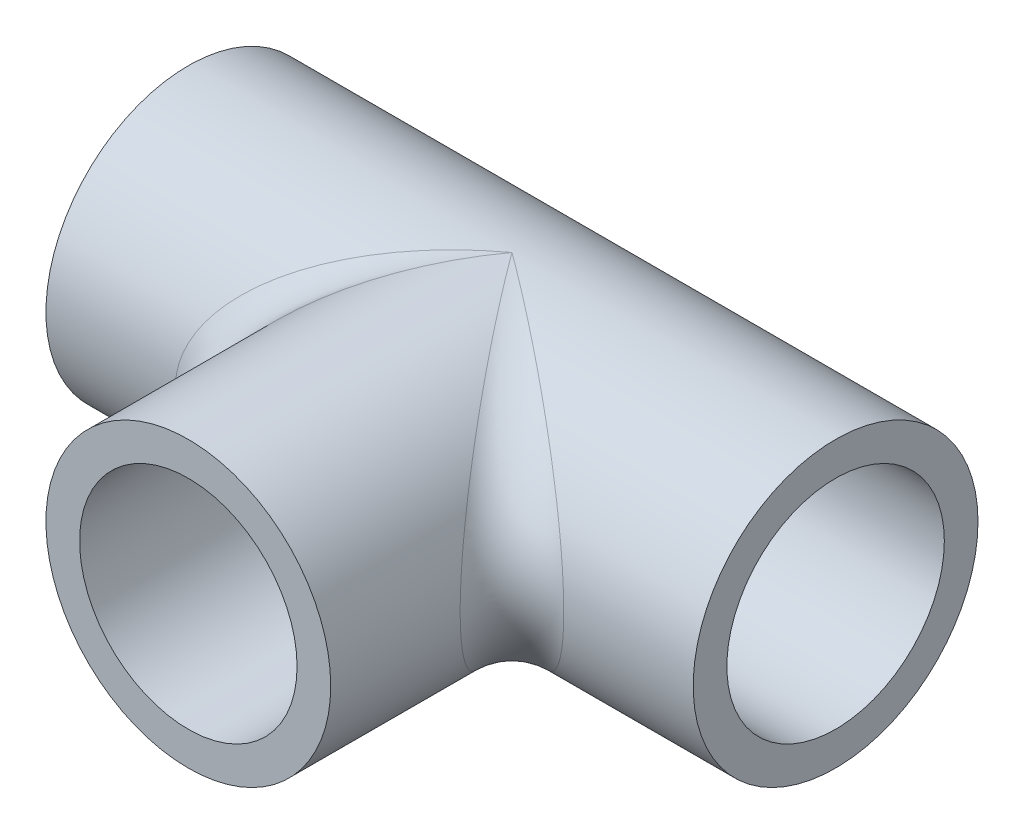
ISO-10303-21;
HEADER;
FILE_DESCRIPTION(('STEP AP214'),'2;1');
FILE_NAME('part.step','',(''),(''),'','','');
FILE_SCHEMA(('AUTOMOTIVE_DESIGN { 1 0 10303 214 1 1 1 1 }'));
ENDSEC;
DATA;
#1=APPLICATION_CONTEXT('core data for automotive mechanical design processes');
#2=APPLICATION_PROTOCOL_DEFINITION('international standard','automotive_design',2000,#1);
#3=PRODUCT_CONTEXT('',#1,'mechanical');
#4=PRODUCT('Part','Part','',(#3));
#5=PRODUCT_RELATED_PRODUCT_CATEGORY('part','',(#4));
#6=PRODUCT_DEFINITION_FORMATION('','',#4);
#7=PRODUCT_DEFINITION_CONTEXT('part definition',#1,'design');
#8=PRODUCT_DEFINITION('design','',#6,#7);
#9=PRODUCT_DEFINITION_SHAPE('','',#8);
#10=(LENGTH_UNIT() NAMED_UNIT(*) SI_UNIT(.MILLI.,.METRE.));
#11=(NAMED_UNIT(*) PLANE_ANGLE_UNIT() SI_UNIT($,.RADIAN.));
#12=(NAMED_UNIT(*) SI_UNIT($,.STERADIAN.) SOLID_ANGLE_UNIT());
#13=UNCERTAINTY_MEASURE_WITH_UNIT(LENGTH_MEASURE(1.E-05),#10,'distance_accuracy_value','');
#14=(GEOMETRIC_REPRESENTATION_CONTEXT(3) GLOBAL_UNCERTAINTY_ASSIGNED_CONTEXT((#13)) GLOBAL_UNIT_ASSIGNED_CONTEXT((#10,
#11,#12)) REPRESENTATION_CONTEXT('',''));
#15=CARTESIAN_POINT('',(0.,0.,0.));
#16=DIRECTION('',(0.,0.,1.));
#17=DIRECTION('',(1.,0.,0.));
#18=AXIS2_PLACEMENT_3D('',#15,#16,#17);
#19=CARTESIAN_POINT('',(63.5,0.,0.));
#20=DIRECTION('',(-1.,0.,0.));
#21=DIRECTION('',(0.,0.,1.));
#22=AXIS2_PLACEMENT_3D('',#19,#20,#21);
#23=CYLINDRICAL_SURFACE('',#22,13.97);
#24=CARTESIAN_POINT('',(0.,0.,0.));
#25=DIRECTION('',(1.,0.,0.));
#26=DIRECTION('',(0.,0.,-1.));
#27=AXIS2_PLACEMENT_3D('',#24,#25,#26);
#28=CIRCLE('',#27,13.97);
#29=CARTESIAN_POINT('',(0.,0.,-13.97));
#30=VERTEX_POINT('',#29);
#31=EDGE_CURVE('E115',#30,#30,#28,.T.);
#32=ORIENTED_EDGE('',*,*,#31,.T.);
#33=EDGE_LOOP('',(#32));
#34=FACE_BOUND('',#33,.T.);
#35=CARTESIAN_POINT('',(63.5,0.,0.));
#36=DIRECTION('',(1.,0.,0.));
#37=DIRECTION('',(0.,0.,-1.));
#38=AXIS2_PLACEMENT_3D('',#35,#36,#37);
#39=CIRCLE('',#38,13.97);
#40=CARTESIAN_POINT('',(63.5,0.,-13.97));
#41=VERTEX_POINT('',#40);
#42=EDGE_CURVE('E67',#41,#41,#39,.T.);
#43=ORIENTED_EDGE('',*,*,#42,.F.);
#44=EDGE_LOOP('',(#43));
#45=FACE_BOUND('',#44,.T.);
#46=CARTESIAN_POINT('',(31.75,0.,0.));
#47=DIRECTION('',(0.591363663627517,0.,0.806404995855705));
#48=DIRECTION('',(0.806404995855705,0.,-0.591363663627517));
#49=AXIS2_PLACEMENT_3D('',#46,#47,#48);
#50=ELLIPSE('',#49,23.6233655519276,13.97);
#51=CARTESIAN_POINT('',(31.75,-13.97,0.));
#52=VERTEX_POINT('',#51);
#53=CARTESIAN_POINT('',(31.75,13.97,0.));
#54=VERTEX_POINT('',#53);
#55=EDGE_CURVE('E45',#52,#54,#50,.F.);
#56=ORIENTED_EDGE('',*,*,#55,.T.);
#57=CARTESIAN_POINT('',(31.75,0.,0.));
#58=DIRECTION('',(-0.591363663627517,0.,0.806404995855705));
#59=DIRECTION('',(-0.806404995855705,0.,-0.591363663627517));
#60=AXIS2_PLACEMENT_3D('',#57,#58,#59);
#61=ELLIPSE('',#60,23.6233655519276,13.97);
#62=EDGE_CURVE('E11',#54,#52,#61,.F.);
#63=ORIENTED_EDGE('',*,*,#62,.T.);
#64=EDGE_LOOP('',(#56,#63));
#65=FACE_BOUND('',#64,.T.);
#66=ADVANCED_FACE('F32',(#34,#45,#65),#23,.T.);
#67=CARTESIAN_POINT('',(63.5,0.,0.));
#68=DIRECTION('',(-1.,0.,0.));
#69=DIRECTION('',(0.,0.,1.));
#70=AXIS2_PLACEMENT_3D('',#67,#68,#69);
#71=CYLINDRICAL_SURFACE('',#70,10.668);
#72=CARTESIAN_POINT('',(31.75,0.,0.));
#73=DIRECTION('',(0.707106781186547,0.,0.707106781186547));
#74=DIRECTION('',(-0.707106781186547,0.,0.707106781186547));
#75=AXIS2_PLACEMENT_3D('',#72,#73,#74);
#76=ELLIPSE('',#75,15.0868302833962,10.668);
#77=CARTESIAN_POINT('',(31.75,-10.668,0.));
#78=VERTEX_POINT('',#77);
#79=CARTESIAN_POINT('',(31.75,10.668,0.));
#80=VERTEX_POINT('',#79);
#81=EDGE_CURVE('E63',#78,#80,#76,.F.);
#82=ORIENTED_EDGE('',*,*,#81,.F.);
#83=CARTESIAN_POINT('',(31.75,0.,0.));
#84=DIRECTION('',(-0.707106781186547,0.,0.707106781186547));
#85=DIRECTION('',(0.707106781186547,0.,0.707106781186547));
#86=AXIS2_PLACEMENT_3D('',#83,#84,#85);
#87=ELLIPSE('',#86,15.0868302833962,10.668);
#88=EDGE_CURVE('E52',#80,#78,#87,.F.);
#89=ORIENTED_EDGE('',*,*,#88,.F.);
#90=EDGE_LOOP('',(#82,#89));
#91=FACE_BOUND('',#90,.T.);
#92=CARTESIAN_POINT('',(63.5,0.,0.));
#93=DIRECTION('',(1.,0.,0.));
#94=DIRECTION('',(0.,0.,-1.));
#95=AXIS2_PLACEMENT_3D('',#92,#93,#94);
#96=CIRCLE('',#95,10.668);
#97=CARTESIAN_POINT('',(63.5,0.,-10.668));
#98=VERTEX_POINT('',#97);
#99=EDGE_CURVE('E188',#98,#98,#96,.T.);
#100=ORIENTED_EDGE('',*,*,#99,.T.);
#101=EDGE_LOOP('',(#100));
#102=FACE_BOUND('',#101,.T.);
#103=CARTESIAN_POINT('',(0.,0.,0.));
#104=DIRECTION('',(1.,0.,0.));
#105=DIRECTION('',(0.,0.,-1.));
#106=AXIS2_PLACEMENT_3D('',#103,#104,#105);
#107=CIRCLE('',#106,10.668);
#108=CARTESIAN_POINT('',(0.,0.,-10.668));
#109=VERTEX_POINT('',#108);
#110=EDGE_CURVE('E185',#109,#109,#107,.T.);
#111=ORIENTED_EDGE('',*,*,#110,.F.);
#112=EDGE_LOOP('',(#111));
#113=FACE_BOUND('',#112,.T.);
#114=ADVANCED_FACE('F64',(#91,#102,#113),#71,.F.);
#115=CARTESIAN_POINT('',(63.5,0.,0.));
#116=DIRECTION('',(1.,0.,0.));
#117=DIRECTION('',(0.,0.,-1.));
#118=AXIS2_PLACEMENT_3D('',#115,#116,#117);
#119=PLANE('',#118);
#120=ORIENTED_EDGE('',*,*,#42,.T.);
#121=EDGE_LOOP('',(#120));
#122=FACE_BOUND('',#121,.T.);
#123=ORIENTED_EDGE('',*,*,#99,.F.);
#124=EDGE_LOOP('',(#123));
#125=FACE_BOUND('',#124,.T.);
#126=ADVANCED_FACE('F100',(#122,#125),#119,.T.);
#127=CARTESIAN_POINT('',(0.,0.,0.));
#128=DIRECTION('',(1.,0.,0.));
#129=DIRECTION('',(0.,0.,-1.));
#130=AXIS2_PLACEMENT_3D('',#127,#128,#129);
#131=PLANE('',#130);
#132=ORIENTED_EDGE('',*,*,#31,.F.);
#133=EDGE_LOOP('',(#132));
#134=FACE_BOUND('',#133,.T.);
#135=ORIENTED_EDGE('',*,*,#110,.T.);
#136=EDGE_LOOP('',(#135));
#137=FACE_BOUND('',#136,.T.);
#138=ADVANCED_FACE('F94',(#134,#137),#131,.F.);
#139=CARTESIAN_POINT('',(31.75,0.,31.75));
#140=DIRECTION('',(0.,0.,-1.));
#141=DIRECTION('',(-1.,0.,0.));
#142=AXIS2_PLACEMENT_3D('',#139,#140,#141);
#143=CYLINDRICAL_SURFACE('',#142,13.97);
#144=CARTESIAN_POINT('',(31.75,0.,31.75));
#145=DIRECTION('',(0.,0.,1.));
#146=DIRECTION('',(1.,0.,0.));
#147=AXIS2_PLACEMENT_3D('',#144,#145,#146);
#148=CIRCLE('',#147,13.97);
#149=CARTESIAN_POINT('',(45.72,0.,31.75));
#150=VERTEX_POINT('',#149);
#151=EDGE_CURVE('E184',#150,#150,#148,.T.);
#152=ORIENTED_EDGE('',*,*,#151,.F.);
#153=EDGE_LOOP('',(#152));
#154=FACE_BOUND('',#153,.T.);
#155=CARTESIAN_POINT('',(31.75,0.,0.));
#156=DIRECTION('',(0.806404995855705,0.,0.591363663627517));
#157=DIRECTION('',(0.591363663627518,0.,-0.806404995855706));
#158=AXIS2_PLACEMENT_3D('',#155,#156,#157);
#159=ELLIPSE('',#158,23.6233655519276,13.97);
#160=EDGE_CURVE('E71',#54,#52,#159,.T.);
#161=ORIENTED_EDGE('',*,*,#160,.T.);
#162=CARTESIAN_POINT('',(31.75,0.,0.));
#163=DIRECTION('',(-0.806404995855705,0.,0.591363663627517));
#164=DIRECTION('',(-0.591363663627518,0.,-0.806404995855706));
#165=AXIS2_PLACEMENT_3D('',#162,#163,#164);
#166=ELLIPSE('',#165,23.6233655519276,13.97);
#167=EDGE_CURVE('E74',#52,#54,#166,.T.);
#168=ORIENTED_EDGE('',*,*,#167,.T.);
#169=EDGE_LOOP('',(#161,#168));
#170=FACE_BOUND('',#169,.T.);
#171=ADVANCED_FACE('F88',(#154,#170),#143,.T.);
#172=CARTESIAN_POINT('',(31.75,0.,31.75));
#173=DIRECTION('',(0.,0.,1.));
#174=DIRECTION('',(1.,0.,0.));
#175=AXIS2_PLACEMENT_3D('',#172,#173,#174);
#176=PLANE('',#175);
#177=CARTESIAN_POINT('',(31.75,0.,31.75));
#178=DIRECTION('',(0.,0.,1.));
#179=DIRECTION('',(1.,0.,0.));
#180=AXIS2_PLACEMENT_3D('',#177,#178,#179);
#181=CIRCLE('',#180,10.668);
#182=CARTESIAN_POINT('',(42.418,0.,31.75));
#183=VERTEX_POINT('',#182);
#184=EDGE_CURVE('E181',#183,#183,#181,.T.);
#185=ORIENTED_EDGE('',*,*,#184,.F.);
#186=EDGE_LOOP('',(#185));
#187=FACE_BOUND('',#186,.T.);
#188=ORIENTED_EDGE('',*,*,#151,.T.);
#189=EDGE_LOOP('',(#188));
#190=FACE_BOUND('',#189,.T.);
#191=ADVANCED_FACE('F93',(#187,#190),#176,.T.);
#192=CARTESIAN_POINT('',(31.75,0.,0.));
#193=DIRECTION('',(0.,0.,1.));
#194=DIRECTION('',(1.,0.,0.));
#195=AXIS2_PLACEMENT_3D('',#192,#193,#194);
#196=CYLINDRICAL_SURFACE('',#195,10.668);
#197=ORIENTED_EDGE('',*,*,#81,.T.);
#198=ORIENTED_EDGE('',*,*,#88,.T.);
#199=EDGE_LOOP('',(#197,#198));
#200=FACE_BOUND('',#199,.T.);
#201=ORIENTED_EDGE('',*,*,#184,.T.);
#202=EDGE_LOOP('',(#201));
#203=FACE_BOUND('',#202,.T.);
#204=ADVANCED_FACE('F69',(#200,#203),#196,.F.);
#205=CARTESIAN_POINT('',(31.75,13.97,0.));
#206=CARTESIAN_POINT('',(31.75,13.97,0.));
#207=CARTESIAN_POINT('',(31.75,13.97,0.));
#208=CARTESIAN_POINT('',(32.1649961409285,13.9699842549138,0.304330503347444));
#209=CARTESIAN_POINT('',(32.1096667924862,13.9700565659444,0.359666792486184));
#210=CARTESIAN_POINT('',(32.0543305033475,13.9699842549138,0.414996140928427));
#211=CARTESIAN_POINT('',(32.5799942044309,13.9600546274544,0.60866241658257));
#212=CARTESIAN_POINT('',(32.4695849669771,13.9564355039773,0.719584966977063));
#213=CARTESIAN_POINT('',(32.3586624165826,13.9600546274544,0.829994204430851));
#214=CARTESIAN_POINT('',(33.409133917505,13.9202548869246,1.21669820617027));
#215=CARTESIAN_POINT('',(33.1874610679892,13.9021529393189,1.43746106798917));
#216=CARTESIAN_POINT('',(32.9666982061703,13.9202548869246,1.65913391750493));
#217=CARTESIAN_POINT('',(33.8232754927435,13.8903831104209,1.52040202801192));
#218=CARTESIAN_POINT('',(33.5459278597396,13.8614118727784,1.79592785973961));
#219=CARTESIAN_POINT('',(33.2704020280119,13.8903831104209,2.07327549274349));
#220=CARTESIAN_POINT('',(34.6462511734208,13.8109262874391,2.12391752717521));
#221=CARTESIAN_POINT('',(34.2563205524132,13.753321149772,2.5063205524132));
#222=CARTESIAN_POINT('',(33.8739175271752,13.8109262874391,2.89625117342079));
#223=CARTESIAN_POINT('',(35.0551004341886,13.7615113850433,2.42374031840482));
#224=CARTESIAN_POINT('',(34.6087738785299,13.6860481220881,2.8587738785299));
#225=CARTESIAN_POINT('',(34.1737403184048,13.7615113850433,3.30510043418856));
#226=CARTESIAN_POINT('',(35.8700560708564,13.6427642875103,3.02137445196121));
#227=CARTESIAN_POINT('',(35.3086840568561,13.5249802993024,3.55868405685604));
#228=CARTESIAN_POINT('',(34.7713744519612,13.6427642875102,4.12005607085638));
#229=CARTESIAN_POINT('',(36.276162507797,13.5734325371204,3.31918583905111));
#230=CARTESIAN_POINT('',(35.6566110960411,13.4309598012804,3.90661109604107));
#231=CARTESIAN_POINT('',(35.0691858390511,13.5734325371204,4.52616250779703));
#232=CARTESIAN_POINT('',(37.4754070464454,13.3377932208124,4.19863183406005));
#233=CARTESIAN_POINT('',(36.6817571660308,13.111757973356,4.93175716603084));
#234=CARTESIAN_POINT('',(35.94863183406,13.3377932208124,5.72540704644541));
#235=CARTESIAN_POINT('',(38.2634853888728,13.1425017232505,4.77655595184007));
#236=CARTESIAN_POINT('',(37.3494701611708,12.8475273175663,5.59947016117086));
#237=CARTESIAN_POINT('',(36.5265559518401,13.1425017232505,6.5134853888728));
#238=CARTESIAN_POINT('',(39.7976214764494,12.6765037832777,5.90158908272951));
#239=CARTESIAN_POINT('',(38.6278252269399,12.22662585353,6.87782522693993));
#240=CARTESIAN_POINT('',(37.6515890827295,12.6765037832777,8.04762147644935));
#241=CARTESIAN_POINT('',(40.5442361255514,12.4077736556231,6.44910649207104));
#242=CARTESIAN_POINT('',(39.2423649749254,11.8690544436702,7.49236497492535));
#243=CARTESIAN_POINT('',(38.199106492071,12.4077736556231,8.79423612555139));
#244=CARTESIAN_POINT('',(41.9825036125598,11.7988243090196,7.5038359825438));
#245=CARTESIAN_POINT('',(40.3985470657572,11.0750005835077,8.6485470657572));
#246=CARTESIAN_POINT('',(39.2538359825438,11.7988243090196,10.2325036125598));
#247=CARTESIAN_POINT('',(42.6751494535918,11.4611528572707,8.01177626596719));
#248=CARTESIAN_POINT('',(40.9438472385974,10.6373830021085,9.19384723859744));
#249=CARTESIAN_POINT('',(39.7617762659672,11.4611528572707,10.9251494535918));
#250=CARTESIAN_POINT('',(43.9931386183787,10.7195012792805,8.97830165347782));
#251=CARTESIAN_POINT('',(41.9476306699542,9.70167833694517,10.1976306699542));
#252=CARTESIAN_POINT('',(40.7283016534778,10.7195012792805,12.2431386183787));
#253=CARTESIAN_POINT('',(44.6200391623138,10.3185278852442,9.43802871903048));
#254=CARTESIAN_POINT('',(42.4093836661912,9.20234455201332,10.6593836661912));
#255=CARTESIAN_POINT('',(41.1880287190305,10.3185278852442,12.8700391623138));
#256=CARTESIAN_POINT('',(45.79515323048,9.45679100040555,10.299779035685));
#257=CARTESIAN_POINT('',(43.2359373323625,8.16697151263523,11.4859373323625));
#258=CARTESIAN_POINT('',(42.049779035685,9.45679100040555,14.04515323048));
#259=CARTESIAN_POINT('',(46.345581201294,8.99930243736231,10.703426214281));
#260=CARTESIAN_POINT('',(43.6034390252966,7.62980546575549,11.8534390252966));
#261=CARTESIAN_POINT('',(42.453426214281,8.99930243736231,14.595581201294));
#262=CARTESIAN_POINT('',(47.3579069654916,8.03173691720862,11.4457984413618));
#263=CARTESIAN_POINT('',(44.2374735442825,6.54692317412924,12.4874735442825));
#264=CARTESIAN_POINT('',(43.1957984413618,8.03173691720862,15.6079069654916));
#265=CARTESIAN_POINT('',(47.8226719732002,7.52494798265213,11.7866261136848));
#266=CARTESIAN_POINT('',(44.5059893267681,6.00053730086408,12.7559893267681));
#267=CARTESIAN_POINT('',(43.5366261136848,7.52494798265213,16.0726719732002));
#268=CARTESIAN_POINT('',(48.4511500062733,6.72669841329189,12.2475100045982));
#269=CARTESIAN_POINT('',(44.8370335359023,5.19695243111478,13.0870335359023));
#270=CARTESIAN_POINT('',(43.9975100045982,6.72669841329189,16.7011500062733));
#271=CARTESIAN_POINT('',(48.6454414853623,6.460808389166,12.3899904225927));
#272=CARTESIAN_POINT('',(44.9346954905956,4.93463298524042,13.1846954905956));
#273=CARTESIAN_POINT('',(44.1399904225927,6.460808389166,16.8954414853623));
#274=CARTESIAN_POINT('',(49.0135962612215,5.91428972249239,12.6599705915581));
#275=CARTESIAN_POINT('',(45.1104469887237,4.41268036659763,13.3604469887237));
#276=CARTESIAN_POINT('',(44.4099705915581,5.91428972249239,17.2635962612215));
#277=CARTESIAN_POINT('',(49.1874686016766,5.63366768508603,12.7874769745647));
#278=CARTESIAN_POINT('',(45.1881862457653,4.15329811076541,13.4381862457653));
#279=CARTESIAN_POINT('',(44.5374769745647,5.63366768508603,17.4374686016766));
#280=CARTESIAN_POINT('',(49.5060389526682,5.06966569867454,13.021095231955));
#281=CARTESIAN_POINT('',(45.3223002745049,3.65069095238762,13.5723002745049));
#282=CARTESIAN_POINT('',(44.771095231955,5.06966569867454,17.7560389526682));
#283=CARTESIAN_POINT('',(49.6516071823309,4.78681523114474,13.1278452670319));
#284=CARTESIAN_POINT('',(45.3791059740195,3.40747584858286,13.6291059740195));
#285=CARTESIAN_POINT('',(44.8778452670319,4.78681523114474,17.9016071823309));
#286=CARTESIAN_POINT('',(49.9193211320922,4.20954793696451,13.3241688301898));
#287=CARTESIAN_POINT('',(45.4770759790601,2.92921539400913,13.7270759790602));
#288=CARTESIAN_POINT('',(45.0741688301898,4.20954793696451,18.1693211320922));
#289=CARTESIAN_POINT('',(50.041478174487,3.9151367848129,13.4137506612881));
#290=CARTESIAN_POINT('',(45.5179778166044,2.6946534990402,13.7679778166044));
#291=CARTESIAN_POINT('',(45.1637506612881,3.9151367848129,18.291478174487));
#292=CARTESIAN_POINT('',(50.2570508685502,3.32514822193886,13.5718373036057));
#293=CARTESIAN_POINT('',(45.5854473300981,2.24182826526539,13.8354473300981));
#294=CARTESIAN_POINT('',(45.3218373036057,3.32514822193886,18.5070508685502));
#295=CARTESIAN_POINT('',(50.351211501477,3.02986437891751,13.6408884344148));
#296=CARTESIAN_POINT('',(45.6122178657871,2.02375883660326,13.8622178657871));
#297=CARTESIAN_POINT('',(45.3908884344148,3.02986437891751,18.601211501477));
#298=CARTESIAN_POINT('',(50.5137787134153,2.43174639516475,13.7601043898348));
#299=CARTESIAN_POINT('',(45.6556718392183,1.59627987534891,13.9056718392183));
#300=CARTESIAN_POINT('',(45.5101043898348,2.43174639516475,18.7637787134153));
#301=CARTESIAN_POINT('',(50.5821864465398,2.12891259343246,13.8102700607951));
#302=CARTESIAN_POINT('',(45.6722223090861,1.38744694786787,13.9222223090861));
#303=CARTESIAN_POINT('',(45.5602700607951,2.12891259343246,18.8321864465398));
#304=CARTESIAN_POINT('',(50.6909684181201,1.52297098121676,13.8900435066221));
#305=CARTESIAN_POINT('',(45.6973515327933,0.97995523835683,13.9473515327933));
#306=CARTESIAN_POINT('',(45.6400435066221,1.52297098121676,18.9409684181201));
#307=CARTESIAN_POINT('',(50.731781658614,1.21994818797686,13.9199732163166));
#308=CARTESIAN_POINT('',(45.7059821026554,0.781736784531004,13.9559821026554));
#309=CARTESIAN_POINT('',(45.6699732163166,1.21994818797686,18.981781658614));
#310=CARTESIAN_POINT('',(50.7862972084516,0.611283565371151,13.9599512861971));
#311=CARTESIAN_POINT('',(45.7173226995639,0.388730363806546,13.9673226995639));
#312=CARTESIAN_POINT('',(45.7099512861971,0.611283565371151,19.0362972084516));
#313=CARTESIAN_POINT('',(50.8,0.305641782685576,13.97));
#314=CARTESIAN_POINT('',(45.72,0.194505292659898,13.97));
#315=CARTESIAN_POINT('',(45.72,0.305641782685577,19.05));
#316=CARTESIAN_POINT('',(50.8,-0.305641782685573,13.97));
#317=CARTESIAN_POINT('',(45.72,-0.194505292659896,13.97));
#318=CARTESIAN_POINT('',(45.72,-0.305641782685573,19.05));
#319=CARTESIAN_POINT('',(50.7862972084516,-0.611283565371148,13.9599512861971));
#320=CARTESIAN_POINT('',(45.7173226995639,-0.388730363806544,13.9673226995639));
#321=CARTESIAN_POINT('',(45.7099512861971,-0.611283565371148,19.0362972084516));
#322=CARTESIAN_POINT('',(50.731781658614,-1.21994818797685,13.9199732163166));
#323=CARTESIAN_POINT('',(45.7059821026554,-0.781736784531002,13.9559821026554));
#324=CARTESIAN_POINT('',(45.6699732163166,-1.21994818797685,18.981781658614));
#325=CARTESIAN_POINT('',(50.6909684181201,-1.52297098121675,13.8900435066221));
#326=CARTESIAN_POINT('',(45.6973515327933,-0.979955238356827,13.9473515327933));
#327=CARTESIAN_POINT('',(45.6400435066221,-1.52297098121675,18.9409684181201));
#328=CARTESIAN_POINT('',(50.5821864465398,-2.12891259343245,13.8102700607951));
#329=CARTESIAN_POINT('',(45.6722223090861,-1.38744694786787,13.9222223090861));
#330=CARTESIAN_POINT('',(45.5602700607951,-2.12891259343245,18.8321864465398));
#331=CARTESIAN_POINT('',(50.5137787134153,-2.43174639516474,13.7601043898348));
#332=CARTESIAN_POINT('',(45.6556718392183,-1.59627987534891,13.9056718392183));
#333=CARTESIAN_POINT('',(45.5101043898348,-2.43174639516474,18.7637787134153));
#334=CARTESIAN_POINT('',(50.351211501477,-3.02986437891751,13.6408884344148));
#335=CARTESIAN_POINT('',(45.6122178657871,-2.02375883660326,13.8622178657871));
#336=CARTESIAN_POINT('',(45.3908884344148,-3.02986437891751,18.601211501477));
#337=CARTESIAN_POINT('',(50.2570508685502,-3.32514822193886,13.5718373036057));
#338=CARTESIAN_POINT('',(45.5854473300981,-2.24182826526539,13.8354473300981));
#339=CARTESIAN_POINT('',(45.3218373036057,-3.32514822193886,18.5070508685502));
#340=CARTESIAN_POINT('',(50.0414781744869,-3.9151367848129,13.4137506612881));
#341=CARTESIAN_POINT('',(45.5179778166044,-2.69465349904019,13.7679778166044));
#342=CARTESIAN_POINT('',(45.1637506612881,-3.9151367848129,18.291478174487));
#343=CARTESIAN_POINT('',(49.9193211320922,-4.20954793696451,13.3241688301898));
#344=CARTESIAN_POINT('',(45.4770759790601,-2.92921539400912,13.7270759790601));
#345=CARTESIAN_POINT('',(45.0741688301898,-4.20954793696451,18.1693211320922));
#346=CARTESIAN_POINT('',(49.6516071823309,-4.78681523114473,13.1278452670319));
#347=CARTESIAN_POINT('',(45.3791059740195,-3.40747584858286,13.6291059740195));
#348=CARTESIAN_POINT('',(44.8778452670319,-4.78681523114473,17.9016071823309));
#349=CARTESIAN_POINT('',(49.5060389526683,-5.06966569867454,13.021095231955));
#350=CARTESIAN_POINT('',(45.3223002745049,-3.65069095238762,13.5723002745049));
#351=CARTESIAN_POINT('',(44.771095231955,-5.06966569867454,17.7560389526682));
#352=CARTESIAN_POINT('',(49.1874686016766,-5.63366768508603,12.7874769745647));
#353=CARTESIAN_POINT('',(45.1881862457653,-4.15329811076541,13.4381862457653));
#354=CARTESIAN_POINT('',(44.5374769745647,-5.63366768508603,17.4374686016766));
#355=CARTESIAN_POINT('',(49.0135962612215,-5.91428972249239,12.6599705915581));
#356=CARTESIAN_POINT('',(45.1104469887237,-4.41268036659763,13.3604469887237));
#357=CARTESIAN_POINT('',(44.4099705915581,-5.91428972249239,17.2635962612215));
#358=CARTESIAN_POINT('',(48.6454414853623,-6.460808389166,12.3899904225927));
#359=CARTESIAN_POINT('',(44.9346954905957,-4.93463298524042,13.1846954905956));
#360=CARTESIAN_POINT('',(44.1399904225927,-6.460808389166,16.8954414853623));
#361=CARTESIAN_POINT('',(48.4511500062733,-6.72669841329188,12.2475100045982));
#362=CARTESIAN_POINT('',(44.8370335359023,-5.19695243111478,13.0870335359023));
#363=CARTESIAN_POINT('',(43.9975100045982,-6.72669841329188,16.7011500062733));
#364=CARTESIAN_POINT('',(47.8226719732002,-7.52494798265213,11.7866261136848));
#365=CARTESIAN_POINT('',(44.5059893267681,-6.00053730086407,12.7559893267681));
#366=CARTESIAN_POINT('',(43.5366261136848,-7.52494798265213,16.0726719732002));
#367=CARTESIAN_POINT('',(47.3579069654916,-8.03173691720862,11.4457984413618));
#368=CARTESIAN_POINT('',(44.2374735442825,-6.54692317412924,12.4874735442825));
#369=CARTESIAN_POINT('',(43.1957984413618,-8.03173691720862,15.6079069654916));
#370=CARTESIAN_POINT('',(46.345581201294,-8.99930243736231,10.703426214281));
#371=CARTESIAN_POINT('',(43.6034390252966,-7.62980546575548,11.8534390252966));
#372=CARTESIAN_POINT('',(42.453426214281,-8.99930243736231,14.595581201294));
#373=CARTESIAN_POINT('',(45.79515323048,-9.45679100040554,10.299779035685));
#374=CARTESIAN_POINT('',(43.2359373323625,-8.16697151263523,11.4859373323625));
#375=CARTESIAN_POINT('',(42.049779035685,-9.45679100040554,14.04515323048));
#376=CARTESIAN_POINT('',(44.6200391623138,-10.3185278852442,9.43802871903048));
#377=CARTESIAN_POINT('',(42.4093836661912,-9.20234455201332,10.6593836661912));
#378=CARTESIAN_POINT('',(41.1880287190305,-10.3185278852442,12.8700391623138));
#379=CARTESIAN_POINT('',(43.9931386183787,-10.7195012792805,8.97830165347783));
#380=CARTESIAN_POINT('',(41.9476306699542,-9.70167833694517,10.1976306699542));
#381=CARTESIAN_POINT('',(40.7283016534778,-10.7195012792805,12.2431386183787));
#382=CARTESIAN_POINT('',(42.6751494535918,-11.4611528572707,8.0117762659672));
#383=CARTESIAN_POINT('',(40.9438472385974,-10.6373830021085,9.19384723859745));
#384=CARTESIAN_POINT('',(39.7617762659672,-11.4611528572707,10.9251494535918));
#385=CARTESIAN_POINT('',(41.9825036125598,-11.7988243090196,7.5038359825438));
#386=CARTESIAN_POINT('',(40.3985470657572,-11.0750005835077,8.64854706575721));
#387=CARTESIAN_POINT('',(39.2538359825438,-11.7988243090196,10.2325036125598));
#388=CARTESIAN_POINT('',(40.5442361255514,-12.4077736556231,6.44910649207105));
#389=CARTESIAN_POINT('',(39.2423649749254,-11.8690544436702,7.49236497492536));
#390=CARTESIAN_POINT('',(38.1991064920711,-12.4077736556231,8.7942361255514));
#391=CARTESIAN_POINT('',(39.7976214764494,-12.6765037832777,5.90158908272951));
#392=CARTESIAN_POINT('',(38.6278252269399,-12.22662585353,6.87782522693993));
#393=CARTESIAN_POINT('',(37.6515890827295,-12.6765037832777,8.04762147644935));
#394=CARTESIAN_POINT('',(38.2634853888728,-13.1425017232505,4.77655595184007));
#395=CARTESIAN_POINT('',(37.3494701611708,-12.8475273175663,5.59947016117085));
#396=CARTESIAN_POINT('',(36.5265559518401,-13.1425017232505,6.5134853888728));
#397=CARTESIAN_POINT('',(37.4754070464454,-13.3377932208124,4.19863183406005));
#398=CARTESIAN_POINT('',(36.6817571660308,-13.111757973356,4.93175716603083));
#399=CARTESIAN_POINT('',(35.94863183406,-13.3377932208124,5.7254070464454));
#400=CARTESIAN_POINT('',(36.276162507797,-13.5734325371204,3.31918583905111));
#401=CARTESIAN_POINT('',(35.6566110960411,-13.4309598012804,3.90661109604107));
#402=CARTESIAN_POINT('',(35.0691858390511,-13.5734325371204,4.52616250779703));
#403=CARTESIAN_POINT('',(35.8700560708564,-13.6427642875103,3.02137445196122));
#404=CARTESIAN_POINT('',(35.3086840568561,-13.5249802993024,3.55868405685605));
#405=CARTESIAN_POINT('',(34.7713744519612,-13.6427642875103,4.12005607085639));
#406=CARTESIAN_POINT('',(35.0551004341886,-13.7615113850433,2.42374031840482));
#407=CARTESIAN_POINT('',(34.6087738785299,-13.6860481220881,2.85877387852991));
#408=CARTESIAN_POINT('',(34.1737403184048,-13.7615113850433,3.30510043418857));
#409=CARTESIAN_POINT('',(34.6462511734208,-13.8109262874391,2.12391752717522));
#410=CARTESIAN_POINT('',(34.2563205524132,-13.753321149772,2.5063205524132));
#411=CARTESIAN_POINT('',(33.8739175271752,-13.8109262874391,2.89625117342079));
#412=CARTESIAN_POINT('',(33.8232754927435,-13.8903831104209,1.52040202801192));
#413=CARTESIAN_POINT('',(33.5459278597396,-13.8614118727784,1.79592785973961));
#414=CARTESIAN_POINT('',(33.2704020280119,-13.8903831104209,2.07327549274349));
#415=CARTESIAN_POINT('',(33.409133917505,-13.9202548869246,1.21669820617028));
#416=CARTESIAN_POINT('',(33.1874610679892,-13.9021529393189,1.43746106798917));
#417=CARTESIAN_POINT('',(32.9666982061703,-13.9202548869246,1.65913391750493));
#418=CARTESIAN_POINT('',(32.5799942044309,-13.9600546274544,0.608662416582579));
#419=CARTESIAN_POINT('',(32.4695849669771,-13.9564355039773,0.719584966977074));
#420=CARTESIAN_POINT('',(32.3586624165826,-13.9600546274544,0.829994204430863));
#421=CARTESIAN_POINT('',(32.1649961409285,-13.9699842549138,0.304330503347454));
#422=CARTESIAN_POINT('',(32.1096667924862,-13.9700565659444,0.359666792486196));
#423=CARTESIAN_POINT('',(32.0543305033475,-13.9699842549138,0.414996140928441));
#424=CARTESIAN_POINT('',(31.75,-13.97,0.));
#425=CARTESIAN_POINT('',(31.75,-13.97,0.));
#426=CARTESIAN_POINT('',(31.75,-13.97,0.));
#427=(BOUNDED_SURFACE() B_SPLINE_SURFACE(3,2,((#205,#206,#207),(#208,#209,#210),(#211,#212,
#213),(#214,#215,#216),(#217,#218,#219),(#220,#221,#222),(#223,#224,#225),(#226,#227,#228),
(#229,#230,#231),(#232,#233,#234),(#235,#236,#237),(#238,#239,#240),(#241,#242,#243),(#244,#245,
#246),(#247,#248,#249),(#250,#251,#252),(#253,#254,#255),(#256,#257,#258),(#259,#260,#261),
(#262,#263,#264),(#265,#266,#267),(#268,#269,#270),(#271,#272,#273),(#274,#275,#276),(#277,#278,
#279),(#280,#281,#282),(#283,#284,#285),(#286,#287,#288),(#289,#290,#291),(#292,#293,#294),
(#295,#296,#297),(#298,#299,#300),(#301,#302,#303),(#304,#305,#306),(#307,#308,#309),(#310,#311,
#312),(#313,#314,#315),(#316,#317,#318),(#319,#320,#321),(#322,#323,#324),(#325,#326,#327),
(#328,#329,#330),(#331,#332,#333),(#334,#335,#336),(#337,#338,#339),(#340,#341,#342),(#343,#344,
#345),(#346,#347,#348),(#349,#350,#351),(#352,#353,#354),(#355,#356,#357),(#358,#359,#360),
(#361,#362,#363),(#364,#365,#366),(#367,#368,#369),(#370,#371,#372),(#373,#374,#375),(#376,#377,
#378),(#379,#380,#381),(#382,#383,#384),(#385,#386,#387),(#388,#389,#390),(#391,#392,#393),
(#394,#395,#396),(#397,#398,#399),(#400,#401,#402),(#403,#404,#405),(#406,#407,#408),(#409,#410,
#411),(#412,#413,#414),(#415,#416,#417),(#418,#419,#420),(#421,#422,#423),(#424,#425,#426)),
.UNSPECIFIED.,.F.,.F.,.F.) B_SPLINE_SURFACE_WITH_KNOTS((4,2,2,2,2,2,2,2,2,2,2,2,2,2,2,2,2,2,2,2,
2,2,2,2,2,2,2,2,2,2,2,2,2,2,2,2,4),(3,3),(0.,1.76052536525382,3.5211975994442,5.26686728520998,
7.01249799283614,10.4442836479573,13.7915293435904,17.0322319899443,20.1498089016421,
23.1345704283631,25.9851727383423,27.3488505802796,28.7119221498668,30.0221057166724,
31.3316540346419,32.6023626685936,33.8730143491152,35.1229430156831,36.3728494499774,
37.6227558842716,38.8726845508395,40.1433362313611,41.4140448653128,42.7235931832823,
44.0337767500879,45.3968483196751,46.7605261616124,49.6111284715917,52.5958899983126,
55.7134669100104,58.9541695563643,62.3014152519974,65.7332009071186,67.4788316147447,
69.2245013005105,70.9851735347009,72.7456988999547),(0.,1.),
.UNSPECIFIED.) GEOMETRIC_REPRESENTATION_ITEM() RATIONAL_B_SPLINE_SURFACE(((1.,1.,1.),(1.,
1.00000025363712,1.),(1.,0.99964406913434,1.),(1.,0.998220692081314,1.),(1.,0.997153440218872,
1.),(1.,0.994321912502836,1.),(1.,0.992563653424357,1.),(1.,0.988355046559176,1.),(1.,
0.985904714226636,1.),(1.,0.977617418233882,1.),(1.,0.970795415085054,1.),(1.,0.954789037052598,
1.),(1.,0.945666997720281,1.),(1.,0.925488038219019,1.),(1.,0.914501947455647,1.),(1.,
0.891169814373501,1.),(1.,0.878891299929364,1.),(1.,0.853707622087997,1.),(1.,0.840851440038998,
1.),(1.,0.815385263467223,1.),(1.,0.802790176991426,1.),(1.,0.784723218179224,1.),(1.,
0.778962685363006,1.),(1.,0.767759899997309,1.),(1.,0.762317507083424,1.),(1.,0.752114588390605,
1.),(1.,0.747335799205571,1.),(1.,0.738380659122798,1.),(1.,0.73420401725336,1.),(1.,
0.72672160435636,1.),(1.,0.72339367827946,1.),(1.,0.717585867142958,1.),(1.,0.715105944080663,
1.),(1.,0.711136414411904,1.),(1.,0.70963131638464,1.),(1.,0.707616508624127,1.),(1.,
0.707106781186548,1.),(1.,0.707106781186548,1.),(1.,0.707616508624127,1.),(1.,0.70963131638464,
1.),(1.,0.711136414411904,1.),(1.,0.715105944080663,1.),(1.,0.717585867142958,1.),(1.,
0.72339367827946,1.),(1.,0.72672160435636,1.),(1.,0.73420401725336,1.),(1.,0.738380659122798,
1.),(1.,0.747335799205571,1.),(1.,0.752114588390604,1.),(1.,0.762317507083424,1.),(1.,
0.767759899997309,1.),(1.,0.778962685363006,1.),(1.,0.784723218179224,1.),(1.,0.802790176991425,
1.),(1.,0.815385263467223,1.),(1.,0.840851440038998,1.),(1.,0.853707622087997,1.),(1.,
0.878891299929364,1.),(1.,0.8911698143735,1.),(1.,0.914501947455646,1.),(1.,0.925488038219019,
1.),(1.,0.945666997720281,1.),(1.,0.954789037052598,1.),(1.,0.970795415085053,1.),(1.,
0.977617418233882,1.),(1.,0.985904714226636,1.),(1.,0.988355046559176,1.),(1.,0.992563653424357,
1.),(1.,0.994321912502836,1.),(1.,0.997153440218872,1.),(1.,0.998220692081314,1.),(1.,
0.99964406913434,1.),(1.,1.00000025363712,1.),(1.,1.,1.))) REPRESENTATION_ITEM('') SURFACE());
#428=ORIENTED_EDGE('',*,*,#167,.F.);
#429=ORIENTED_EDGE('',*,*,#62,.F.);
#430=EDGE_LOOP('',(#428,#429));
#431=FACE_BOUND('',#430,.T.);
#432=ADVANCED_FACE('F81',(#431),#427,.F.);
#433=CARTESIAN_POINT('',(31.75,-13.97,0.));
#434=CARTESIAN_POINT('',(31.75,-13.97,0.));
#435=CARTESIAN_POINT('',(31.75,-13.97,0.));
#436=CARTESIAN_POINT('',(31.3350038590715,-13.9699842549138,0.304330503347445));
#437=CARTESIAN_POINT('',(31.3903332075138,-13.9700565659444,0.359666792486186));
#438=CARTESIAN_POINT('',(31.4456694966525,-13.9699842549138,0.414996140928428));
#439=CARTESIAN_POINT('',(30.9200057955691,-13.9600546274544,0.608662416582571));
#440=CARTESIAN_POINT('',(31.0304150330229,-13.9564355039773,0.719584966977064));
#441=CARTESIAN_POINT('',(31.1413375834174,-13.9600546274544,0.829994204430852));
#442=CARTESIAN_POINT('',(30.090866082495,-13.9202548869246,1.21669820617027));
#443=CARTESIAN_POINT('',(30.3125389320108,-13.9021529393189,1.43746106798916));
#444=CARTESIAN_POINT('',(30.5333017938297,-13.9202548869246,1.65913391750493));
#445=CARTESIAN_POINT('',(29.6767245072565,-13.8903831104209,1.52040202801192));
#446=CARTESIAN_POINT('',(29.9540721402604,-13.8614118727784,1.79592785973961));
#447=CARTESIAN_POINT('',(30.2295979719881,-13.8903831104209,2.07327549274349));
#448=CARTESIAN_POINT('',(28.8537488265792,-13.8109262874391,2.12391752717522));
#449=CARTESIAN_POINT('',(29.2436794475868,-13.753321149772,2.5063205524132));
#450=CARTESIAN_POINT('',(29.6260824728248,-13.8109262874391,2.89625117342079));
#451=CARTESIAN_POINT('',(28.4448995658114,-13.7615113850433,2.42374031840482));
#452=CARTESIAN_POINT('',(28.8912261214701,-13.6860481220881,2.8587738785299));
#453=CARTESIAN_POINT('',(29.3262596815952,-13.7615113850433,3.30510043418856));
#454=CARTESIAN_POINT('',(27.6299439291436,-13.6427642875103,3.02137445196122));
#455=CARTESIAN_POINT('',(28.1913159431439,-13.5249802993024,3.55868405685604));
#456=CARTESIAN_POINT('',(28.7286255480388,-13.6427642875102,4.12005607085638));
#457=CARTESIAN_POINT('',(27.223837492203,-13.5734325371204,3.31918583905111));
#458=CARTESIAN_POINT('',(27.8433889039589,-13.4309598012804,3.90661109604107));
#459=CARTESIAN_POINT('',(28.4308141609489,-13.5734325371204,4.52616250779703));
#460=CARTESIAN_POINT('',(26.0245929535546,-13.3377932208124,4.19863183406005));
#461=CARTESIAN_POINT('',(26.8182428339692,-13.111757973356,4.93175716603084));
#462=CARTESIAN_POINT('',(27.55136816594,-13.3377932208124,5.72540704644541));
#463=CARTESIAN_POINT('',(25.2365146111272,-13.1425017232505,4.77655595184007));
#464=CARTESIAN_POINT('',(26.1505298388291,-12.8475273175663,5.59947016117086));
#465=CARTESIAN_POINT('',(26.9734440481599,-13.1425017232505,6.5134853888728));
#466=CARTESIAN_POINT('',(23.7023785235506,-12.6765037832777,5.90158908272951));
#467=CARTESIAN_POINT('',(24.8721747730601,-12.22662585353,6.87782522693993));
#468=CARTESIAN_POINT('',(25.8484109172705,-12.6765037832777,8.04762147644935));
#469=CARTESIAN_POINT('',(22.9557638744486,-12.4077736556231,6.44910649207104));
#470=CARTESIAN_POINT('',(24.2576350250746,-11.8690544436702,7.49236497492535));
#471=CARTESIAN_POINT('',(25.300893507929,-12.4077736556231,8.79423612555139));
#472=CARTESIAN_POINT('',(21.5174963874402,-11.7988243090196,7.5038359825438));
#473=CARTESIAN_POINT('',(23.1014529342428,-11.0750005835077,8.6485470657572));
#474=CARTESIAN_POINT('',(24.2461640174562,-11.7988243090196,10.2325036125598));
#475=CARTESIAN_POINT('',(20.8248505464082,-11.4611528572707,8.01177626596719));
#476=CARTESIAN_POINT('',(22.5561527614026,-10.6373830021085,9.19384723859744));
#477=CARTESIAN_POINT('',(23.7382237340328,-11.4611528572707,10.9251494535918));
#478=CARTESIAN_POINT('',(19.5068613816213,-10.7195012792805,8.97830165347782));
#479=CARTESIAN_POINT('',(21.5523693300458,-9.70167833694518,10.1976306699542));
#480=CARTESIAN_POINT('',(22.7716983465222,-10.7195012792805,12.2431386183787));
#481=CARTESIAN_POINT('',(18.8799608376862,-10.3185278852442,9.43802871903048));
#482=CARTESIAN_POINT('',(21.0906163338088,-9.20234455201333,10.6593836661912));
#483=CARTESIAN_POINT('',(22.3119712809695,-10.3185278852442,12.8700391623138));
#484=CARTESIAN_POINT('',(17.70484676952,-9.45679100040554,10.299779035685));
#485=CARTESIAN_POINT('',(20.2640626676375,-8.16697151263523,11.4859373323625));
#486=CARTESIAN_POINT('',(21.450220964315,-9.45679100040555,14.04515323048));
#487=CARTESIAN_POINT('',(17.154418798706,-8.99930243736231,10.703426214281));
#488=CARTESIAN_POINT('',(19.8965609747034,-7.62980546575549,11.8534390252966));
#489=CARTESIAN_POINT('',(21.046573785719,-8.99930243736231,14.595581201294));
#490=CARTESIAN_POINT('',(16.1420930345084,-8.03173691720862,11.4457984413618));
#491=CARTESIAN_POINT('',(19.2625264557175,-6.54692317412924,12.4874735442825));
#492=CARTESIAN_POINT('',(20.3042015586382,-8.03173691720862,15.6079069654916));
#493=CARTESIAN_POINT('',(15.6773280267998,-7.52494798265213,11.7866261136848));
#494=CARTESIAN_POINT('',(18.9940106732319,-6.00053730086408,12.7559893267681));
#495=CARTESIAN_POINT('',(19.9633738863152,-7.52494798265213,16.0726719732002));
#496=CARTESIAN_POINT('',(15.0488499937267,-6.72669841329188,12.2475100045982));
#497=CARTESIAN_POINT('',(18.6629664640977,-5.19695243111478,13.0870335359023));
#498=CARTESIAN_POINT('',(19.5024899954018,-6.72669841329189,16.7011500062733));
#499=CARTESIAN_POINT('',(14.8545585146377,-6.460808389166,12.3899904225927));
#500=CARTESIAN_POINT('',(18.5653045094044,-4.93463298524042,13.1846954905956));
#501=CARTESIAN_POINT('',(19.3600095774073,-6.460808389166,16.8954414853623));
#502=CARTESIAN_POINT('',(14.4864037387785,-5.91428972249239,12.6599705915581));
#503=CARTESIAN_POINT('',(18.3895530112763,-4.41268036659763,13.3604469887237));
#504=CARTESIAN_POINT('',(19.0900294084419,-5.91428972249239,17.2635962612215));
#505=CARTESIAN_POINT('',(14.3125313983234,-5.63366768508603,12.7874769745647));
#506=CARTESIAN_POINT('',(18.3118137542347,-4.15329811076541,13.4381862457653));
#507=CARTESIAN_POINT('',(18.9625230254353,-5.63366768508603,17.4374686016766));
#508=CARTESIAN_POINT('',(13.9939610473318,-5.06966569867454,13.021095231955));
#509=CARTESIAN_POINT('',(18.1776997254951,-3.65069095238762,13.5723002745049));
#510=CARTESIAN_POINT('',(18.728904768045,-5.06966569867454,17.7560389526682));
#511=CARTESIAN_POINT('',(13.8483928176691,-4.78681523114474,13.1278452670319));
#512=CARTESIAN_POINT('',(18.1208940259805,-3.40747584858286,13.6291059740195));
#513=CARTESIAN_POINT('',(18.6221547329681,-4.78681523114474,17.9016071823309));
#514=CARTESIAN_POINT('',(13.5806788679078,-4.20954793696451,13.3241688301898));
#515=CARTESIAN_POINT('',(18.0229240209399,-2.92921539400912,13.7270759790601));
#516=CARTESIAN_POINT('',(18.4258311698102,-4.20954793696451,18.1693211320922));
#517=CARTESIAN_POINT('',(13.458521825513,-3.9151367848129,13.4137506612881));
#518=CARTESIAN_POINT('',(17.9820221833956,-2.6946534990402,13.7679778166044));
#519=CARTESIAN_POINT('',(18.3362493387119,-3.9151367848129,18.291478174487));
#520=CARTESIAN_POINT('',(13.2429491314498,-3.32514822193886,13.5718373036057));
#521=CARTESIAN_POINT('',(17.9145526699019,-2.24182826526539,13.8354473300981));
#522=CARTESIAN_POINT('',(18.1781626963943,-3.32514822193886,18.5070508685502));
#523=CARTESIAN_POINT('',(13.148788498523,-3.02986437891751,13.6408884344148));
#524=CARTESIAN_POINT('',(17.8877821342129,-2.02375883660326,13.8622178657871));
#525=CARTESIAN_POINT('',(18.1091115655852,-3.02986437891751,18.601211501477));
#526=CARTESIAN_POINT('',(12.9862212865847,-2.43174639516475,13.7601043898348));
#527=CARTESIAN_POINT('',(17.8443281607817,-1.59627987534891,13.9056718392183));
#528=CARTESIAN_POINT('',(17.9898956101652,-2.43174639516475,18.7637787134153));
#529=CARTESIAN_POINT('',(12.9178135534602,-2.12891259343246,13.8102700607951));
#530=CARTESIAN_POINT('',(17.827777690914,-1.38744694786787,13.9222223090861));
#531=CARTESIAN_POINT('',(17.9397299392049,-2.12891259343246,18.8321864465398));
#532=CARTESIAN_POINT('',(12.8090315818799,-1.52297098121676,13.8900435066221));
#533=CARTESIAN_POINT('',(17.8026484672067,-0.97995523835683,13.9473515327933));
#534=CARTESIAN_POINT('',(17.8599564933779,-1.52297098121676,18.9409684181201));
#535=CARTESIAN_POINT('',(12.768218341386,-1.21994818797686,13.9199732163166));
#536=CARTESIAN_POINT('',(17.7940178973446,-0.781736784531004,13.9559821026554));
#537=CARTESIAN_POINT('',(17.8300267836834,-1.21994818797686,18.981781658614));
#538=CARTESIAN_POINT('',(12.7137027915484,-0.611283565371151,13.9599512861971));
#539=CARTESIAN_POINT('',(17.7826773004361,-0.388730363806546,13.9673226995639));
#540=CARTESIAN_POINT('',(17.7900487138029,-0.611283565371151,19.0362972084516));
#541=CARTESIAN_POINT('',(12.7,-0.305641782685577,13.97));
#542=CARTESIAN_POINT('',(17.78,-0.194505292659898,13.97));
#543=CARTESIAN_POINT('',(17.78,-0.305641782685577,19.05));
#544=CARTESIAN_POINT('',(12.7,0.305641782685573,13.97));
#545=CARTESIAN_POINT('',(17.78,0.194505292659896,13.97));
#546=CARTESIAN_POINT('',(17.78,0.305641782685573,19.05));
#547=CARTESIAN_POINT('',(12.7137027915484,0.611283565371149,13.9599512861971));
#548=CARTESIAN_POINT('',(17.7826773004361,0.388730363806544,13.9673226995639));
#549=CARTESIAN_POINT('',(17.7900487138029,0.611283565371149,19.0362972084516));
#550=CARTESIAN_POINT('',(12.768218341386,1.21994818797685,13.9199732163166));
#551=CARTESIAN_POINT('',(17.7940178973446,0.781736784531002,13.9559821026554));
#552=CARTESIAN_POINT('',(17.8300267836834,1.21994818797685,18.981781658614));
#553=CARTESIAN_POINT('',(12.8090315818799,1.52297098121675,13.8900435066221));
#554=CARTESIAN_POINT('',(17.8026484672067,0.979955238356827,13.9473515327933));
#555=CARTESIAN_POINT('',(17.8599564933779,1.52297098121675,18.9409684181201));
#556=CARTESIAN_POINT('',(12.9178135534602,2.12891259343245,13.8102700607951));
#557=CARTESIAN_POINT('',(17.827777690914,1.38744694786787,13.9222223090861));
#558=CARTESIAN_POINT('',(17.9397299392049,2.12891259343245,18.8321864465398));
#559=CARTESIAN_POINT('',(12.9862212865847,2.43174639516474,13.7601043898348));
#560=CARTESIAN_POINT('',(17.8443281607817,1.59627987534891,13.9056718392183));
#561=CARTESIAN_POINT('',(17.9898956101652,2.43174639516474,18.7637787134153));
#562=CARTESIAN_POINT('',(13.148788498523,3.02986437891751,13.6408884344148));
#563=CARTESIAN_POINT('',(17.8877821342129,2.02375883660326,13.8622178657871));
#564=CARTESIAN_POINT('',(18.1091115655852,3.02986437891751,18.601211501477));
#565=CARTESIAN_POINT('',(13.2429491314498,3.32514822193886,13.5718373036057));
#566=CARTESIAN_POINT('',(17.9145526699019,2.24182826526539,13.8354473300981));
#567=CARTESIAN_POINT('',(18.1781626963943,3.32514822193886,18.5070508685502));
#568=CARTESIAN_POINT('',(13.458521825513,3.9151367848129,13.4137506612881));
#569=CARTESIAN_POINT('',(17.9820221833956,2.69465349904019,13.7679778166044));
#570=CARTESIAN_POINT('',(18.3362493387119,3.9151367848129,18.291478174487));
#571=CARTESIAN_POINT('',(13.5806788679078,4.20954793696451,13.3241688301898));
#572=CARTESIAN_POINT('',(18.0229240209398,2.92921539400912,13.7270759790601));
#573=CARTESIAN_POINT('',(18.4258311698102,4.20954793696451,18.1693211320922));
#574=CARTESIAN_POINT('',(13.8483928176691,4.78681523114473,13.1278452670319));
#575=CARTESIAN_POINT('',(18.1208940259805,3.40747584858286,13.6291059740195));
#576=CARTESIAN_POINT('',(18.6221547329681,4.78681523114473,17.9016071823309));
#577=CARTESIAN_POINT('',(13.9939610473318,5.06966569867454,13.021095231955));
#578=CARTESIAN_POINT('',(18.1776997254951,3.65069095238762,13.5723002745049));
#579=CARTESIAN_POINT('',(18.728904768045,5.06966569867454,17.7560389526682));
#580=CARTESIAN_POINT('',(14.3125313983234,5.63366768508603,12.7874769745647));
#581=CARTESIAN_POINT('',(18.3118137542347,4.15329811076541,13.4381862457653));
#582=CARTESIAN_POINT('',(18.9625230254353,5.63366768508603,17.4374686016766));
#583=CARTESIAN_POINT('',(14.4864037387785,5.91428972249239,12.6599705915581));
#584=CARTESIAN_POINT('',(18.3895530112763,4.41268036659763,13.3604469887237));
#585=CARTESIAN_POINT('',(19.0900294084419,5.91428972249239,17.2635962612215));
#586=CARTESIAN_POINT('',(14.8545585146377,6.460808389166,12.3899904225927));
#587=CARTESIAN_POINT('',(18.5653045094044,4.93463298524042,13.1846954905956));
#588=CARTESIAN_POINT('',(19.3600095774073,6.46080838916599,16.8954414853623));
#589=CARTESIAN_POINT('',(15.0488499937267,6.72669841329188,12.2475100045982));
#590=CARTESIAN_POINT('',(18.6629664640977,5.19695243111478,13.0870335359023));
#591=CARTESIAN_POINT('',(19.5024899954018,6.72669841329188,16.7011500062733));
#592=CARTESIAN_POINT('',(15.6773280267998,7.52494798265213,11.7866261136848));
#593=CARTESIAN_POINT('',(18.9940106732319,6.00053730086408,12.7559893267681));
#594=CARTESIAN_POINT('',(19.9633738863152,7.52494798265213,16.0726719732002));
#595=CARTESIAN_POINT('',(16.1420930345084,8.03173691720862,11.4457984413618));
#596=CARTESIAN_POINT('',(19.2625264557175,6.54692317412924,12.4874735442825));
#597=CARTESIAN_POINT('',(20.3042015586382,8.03173691720862,15.6079069654916));
#598=CARTESIAN_POINT('',(17.154418798706,8.99930243736231,10.703426214281));
#599=CARTESIAN_POINT('',(19.8965609747034,7.62980546575548,11.8534390252966));
#600=CARTESIAN_POINT('',(21.046573785719,8.99930243736231,14.595581201294));
#601=CARTESIAN_POINT('',(17.70484676952,9.45679100040554,10.299779035685));
#602=CARTESIAN_POINT('',(20.2640626676375,8.16697151263523,11.4859373323625));
#603=CARTESIAN_POINT('',(21.450220964315,9.45679100040554,14.04515323048));
#604=CARTESIAN_POINT('',(18.8799608376862,10.3185278852442,9.43802871903048));
#605=CARTESIAN_POINT('',(21.0906163338088,9.20234455201332,10.6593836661912));
#606=CARTESIAN_POINT('',(22.3119712809695,10.3185278852442,12.8700391623138));
#607=CARTESIAN_POINT('',(19.5068613816213,10.7195012792805,8.97830165347783));
#608=CARTESIAN_POINT('',(21.5523693300458,9.70167833694517,10.1976306699542));
#609=CARTESIAN_POINT('',(22.7716983465222,10.7195012792805,12.2431386183787));
#610=CARTESIAN_POINT('',(20.8248505464082,11.4611528572707,8.0117762659672));
#611=CARTESIAN_POINT('',(22.5561527614026,10.6373830021085,9.19384723859745));
#612=CARTESIAN_POINT('',(23.7382237340328,11.4611528572707,10.9251494535918));
#613=CARTESIAN_POINT('',(21.5174963874402,11.7988243090196,7.5038359825438));
#614=CARTESIAN_POINT('',(23.1014529342428,11.0750005835077,8.64854706575721));
#615=CARTESIAN_POINT('',(24.2461640174562,11.7988243090196,10.2325036125598));
#616=CARTESIAN_POINT('',(22.9557638744486,12.4077736556231,6.44910649207105));
#617=CARTESIAN_POINT('',(24.2576350250746,11.8690544436702,7.49236497492536));
#618=CARTESIAN_POINT('',(25.300893507929,12.4077736556231,8.7942361255514));
#619=CARTESIAN_POINT('',(23.7023785235506,12.6765037832777,5.90158908272951));
#620=CARTESIAN_POINT('',(24.8721747730601,12.22662585353,6.87782522693993));
#621=CARTESIAN_POINT('',(25.8484109172705,12.6765037832777,8.04762147644935));
#622=CARTESIAN_POINT('',(25.2365146111272,13.1425017232505,4.77655595184007));
#623=CARTESIAN_POINT('',(26.1505298388291,12.8475273175663,5.59947016117085));
#624=CARTESIAN_POINT('',(26.9734440481599,13.1425017232505,6.5134853888728));
#625=CARTESIAN_POINT('',(26.0245929535546,13.3377932208124,4.19863183406005));
#626=CARTESIAN_POINT('',(26.8182428339692,13.111757973356,4.93175716603084));
#627=CARTESIAN_POINT('',(27.55136816594,13.3377932208124,5.7254070464454));
#628=CARTESIAN_POINT('',(27.223837492203,13.5734325371204,3.31918583905111));
#629=CARTESIAN_POINT('',(27.8433889039589,13.4309598012804,3.90661109604107));
#630=CARTESIAN_POINT('',(28.4308141609489,13.5734325371204,4.52616250779703));
#631=CARTESIAN_POINT('',(27.6299439291436,13.6427642875103,3.02137445196122));
#632=CARTESIAN_POINT('',(28.1913159431439,13.5249802993024,3.55868405685604));
#633=CARTESIAN_POINT('',(28.7286255480388,13.6427642875103,4.12005607085638));
#634=CARTESIAN_POINT('',(28.4448995658114,13.7615113850433,2.42374031840482));
#635=CARTESIAN_POINT('',(28.8912261214701,13.6860481220881,2.8587738785299));
#636=CARTESIAN_POINT('',(29.3262596815952,13.7615113850433,3.30510043418856));
#637=CARTESIAN_POINT('',(28.8537488265792,13.8109262874391,2.12391752717522));
#638=CARTESIAN_POINT('',(29.2436794475868,13.753321149772,2.5063205524132));
#639=CARTESIAN_POINT('',(29.6260824728248,13.8109262874391,2.89625117342079));
#640=CARTESIAN_POINT('',(29.6767245072565,13.8903831104209,1.52040202801192));
#641=CARTESIAN_POINT('',(29.9540721402604,13.8614118727784,1.79592785973961));
#642=CARTESIAN_POINT('',(30.2295979719881,13.8903831104209,2.07327549274349));
#643=CARTESIAN_POINT('',(30.090866082495,13.9202548869246,1.21669820617028));
#644=CARTESIAN_POINT('',(30.3125389320108,13.9021529393189,1.43746106798917));
#645=CARTESIAN_POINT('',(30.5333017938297,13.9202548869246,1.65913391750493));
#646=CARTESIAN_POINT('',(30.9200057955691,13.9600546274544,0.608662416582577));
#647=CARTESIAN_POINT('',(31.0304150330229,13.9564355039773,0.719584966977072));
#648=CARTESIAN_POINT('',(31.1413375834174,13.9600546274544,0.829994204430861));
#649=CARTESIAN_POINT('',(31.3350038590715,13.9699842549138,0.304330503347451));
#650=CARTESIAN_POINT('',(31.3903332075138,13.9700565659444,0.359666792486193));
#651=CARTESIAN_POINT('',(31.4456694966525,13.9699842549138,0.414996140928436));
#652=CARTESIAN_POINT('',(31.75,13.97,0.));
#653=CARTESIAN_POINT('',(31.75,13.97,0.));
#654=CARTESIAN_POINT('',(31.75,13.97,0.));
#655=(BOUNDED_SURFACE() B_SPLINE_SURFACE(3,2,((#433,#434,#435),(#436,#437,#438),(#439,#440,
#441),(#442,#443,#444),(#445,#446,#447),(#448,#449,#450),(#451,#452,#453),(#454,#455,#456),
(#457,#458,#459),(#460,#461,#462),(#463,#464,#465),(#466,#467,#468),(#469,#470,#471),(#472,#473,
#474),(#475,#476,#477),(#478,#479,#480),(#481,#482,#483),(#484,#485,#486),(#487,#488,#489),
(#490,#491,#492),(#493,#494,#495),(#496,#497,#498),(#499,#500,#501),(#502,#503,#504),(#505,#506,
#507),(#508,#509,#510),(#511,#512,#513),(#514,#515,#516),(#517,#518,#519),(#520,#521,#522),
(#523,#524,#525),(#526,#527,#528),(#529,#530,#531),(#532,#533,#534),(#535,#536,#537),(#538,#539,
#540),(#541,#542,#543),(#544,#545,#546),(#547,#548,#549),(#550,#551,#552),(#553,#554,#555),
(#556,#557,#558),(#559,#560,#561),(#562,#563,#564),(#565,#566,#567),(#568,#569,#570),(#571,#572,
#573),(#574,#575,#576),(#577,#578,#579),(#580,#581,#582),(#583,#584,#585),(#586,#587,#588),
(#589,#590,#591),(#592,#593,#594),(#595,#596,#597),(#598,#599,#600),(#601,#602,#603),(#604,#605,
#606),(#607,#608,#609),(#610,#611,#612),(#613,#614,#615),(#616,#617,#618),(#619,#620,#621),
(#622,#623,#624),(#625,#626,#627),(#628,#629,#630),(#631,#632,#633),(#634,#635,#636),(#637,#638,
#639),(#640,#641,#642),(#643,#644,#645),(#646,#647,#648),(#649,#650,#651),(#652,#653,#654)),
.UNSPECIFIED.,.F.,.F.,.F.) B_SPLINE_SURFACE_WITH_KNOTS((4,2,2,2,2,2,2,2,2,2,2,2,2,2,2,2,2,2,2,2,
2,2,2,2,2,2,2,2,2,2,2,2,2,2,2,2,4),(3,3),(0.,1.76052536525382,3.5211975994442,5.26686728520999,
7.01249799283614,10.4442836479573,13.7915293435904,17.0322319899443,20.1498089016421,
23.1345704283631,25.9851727383423,27.3488505802796,28.7119221498668,30.0221057166724,
31.3316540346419,32.6023626685936,33.8730143491152,35.1229430156831,36.3728494499774,
37.6227558842716,38.8726845508395,40.1433362313611,41.4140448653128,42.7235931832823,
44.0337767500879,45.3968483196751,46.7605261616124,49.6111284715917,52.5958899983126,
55.7134669100104,58.9541695563643,62.3014152519974,65.7332009071186,67.4788316147448,
69.2245013005106,70.9851735347009,72.7456988999547),(0.,1.),
.UNSPECIFIED.) GEOMETRIC_REPRESENTATION_ITEM() RATIONAL_B_SPLINE_SURFACE(((1.,1.,1.),(1.,
1.00000025363712,1.),(1.,0.99964406913434,1.),(1.,0.998220692081314,1.),(1.,0.997153440218872,
1.),(1.,0.994321912502836,1.),(1.,0.992563653424357,1.),(1.,0.988355046559176,1.),(1.,
0.985904714226636,1.),(1.,0.977617418233882,1.),(1.,0.970795415085053,1.),(1.,0.954789037052598,
1.),(1.,0.945666997720282,1.),(1.,0.92548803821902,1.),(1.,0.914501947455647,1.),(1.,
0.891169814373501,1.),(1.,0.878891299929364,1.),(1.,0.853707622087997,1.),(1.,0.840851440038998,
1.),(1.,0.815385263467223,1.),(1.,0.802790176991426,1.),(1.,0.784723218179224,1.),(1.,
0.778962685363006,1.),(1.,0.767759899997309,1.),(1.,0.762317507083424,1.),(1.,0.752114588390605,
1.),(1.,0.747335799205571,1.),(1.,0.738380659122798,1.),(1.,0.73420401725336,1.),(1.,
0.72672160435636,1.),(1.,0.72339367827946,1.),(1.,0.717585867142958,1.),(1.,0.715105944080663,
1.),(1.,0.711136414411904,1.),(1.,0.70963131638464,1.),(1.,0.707616508624127,1.),(1.,
0.707106781186548,1.),(1.,0.707106781186548,1.),(1.,0.707616508624127,1.),(1.,0.70963131638464,
1.),(1.,0.711136414411904,1.),(1.,0.715105944080663,1.),(1.,0.717585867142958,1.),(1.,
0.72339367827946,1.),(1.,0.72672160435636,1.),(1.,0.73420401725336,1.),(1.,0.738380659122798,
1.),(1.,0.747335799205571,1.),(1.,0.752114588390604,1.),(1.,0.762317507083424,1.),(1.,
0.767759899997309,1.),(1.,0.778962685363006,1.),(1.,0.784723218179224,1.),(1.,0.802790176991426,
1.),(1.,0.815385263467223,1.),(1.,0.840851440038998,1.),(1.,0.853707622087997,1.),(1.,
0.878891299929363,1.),(1.,0.8911698143735,1.),(1.,0.914501947455646,1.),(1.,0.925488038219019,
1.),(1.,0.945666997720281,1.),(1.,0.954789037052598,1.),(1.,0.970795415085053,1.),(1.,
0.977617418233882,1.),(1.,0.985904714226636,1.),(1.,0.988355046559177,1.),(1.,0.992563653424357,
1.),(1.,0.994321912502836,1.),(1.,0.997153440218872,1.),(1.,0.998220692081314,1.),(1.,
0.99964406913434,1.),(1.,1.00000025363712,1.),(1.,1.,1.))) REPRESENTATION_ITEM('') SURFACE());
#656=ORIENTED_EDGE('',*,*,#160,.F.);
#657=ORIENTED_EDGE('',*,*,#55,.F.);
#658=EDGE_LOOP('',(#656,#657));
#659=FACE_BOUND('',#658,.T.);
#660=ADVANCED_FACE('F34',(#659),#655,.F.);
#661=CLOSED_SHELL('',(#66,#114,#126,#138,#171,#191,#204,#432,#660));
#662=MANIFOLD_SOLID_BREP('B2',#661);
#663=ADVANCED_BREP_SHAPE_REPRESENTATION('',(#18,#662),#14);
#664=SHAPE_DEFINITION_REPRESENTATION(#9,#663);
ENDSEC;
END-ISO-10303-21;
